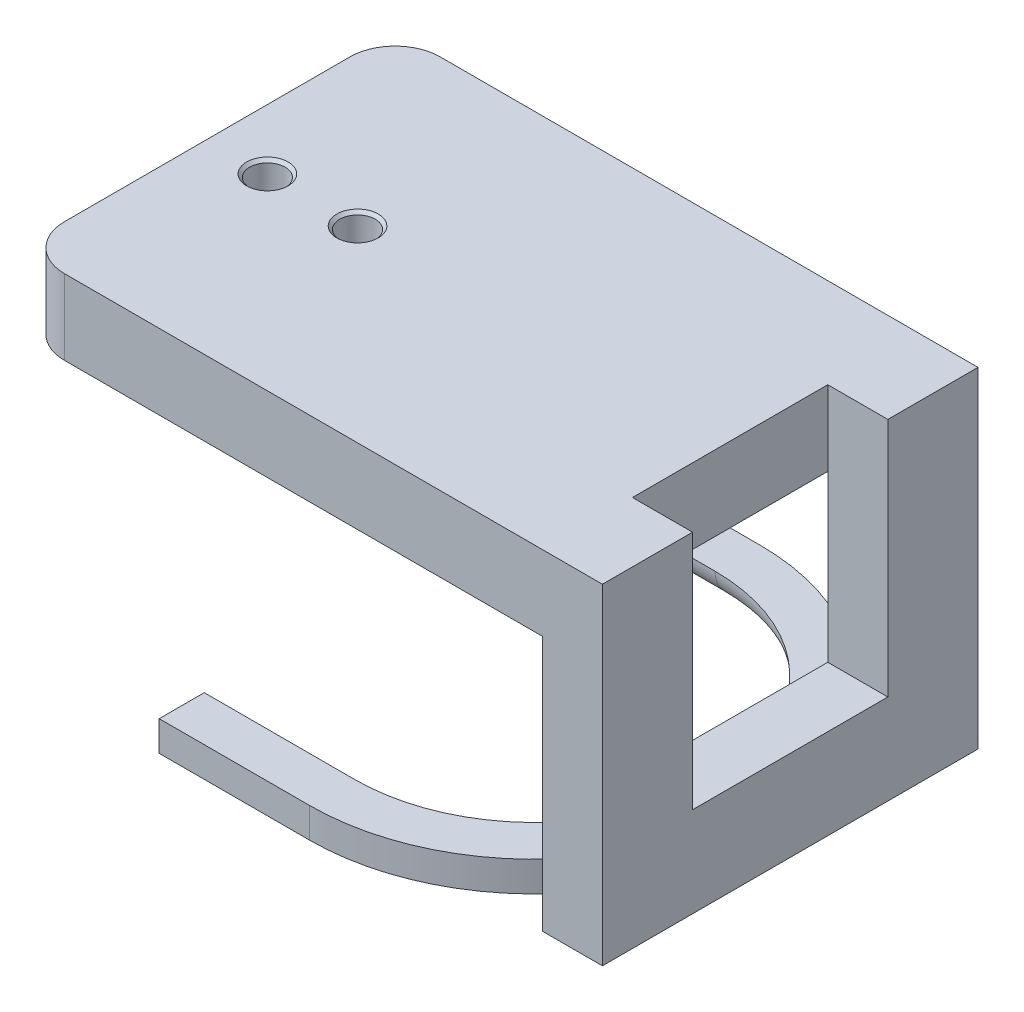
ISO-10303-21;
HEADER;
FILE_DESCRIPTION(('STEP AP214'),'2;1');
FILE_NAME('part.step','',(''),(''),'','','');
FILE_SCHEMA(('AUTOMOTIVE_DESIGN { 1 0 10303 214 1 1 1 1 }'));
ENDSEC;
DATA;
#1=APPLICATION_CONTEXT('core data for automotive mechanical design processes');
#2=APPLICATION_PROTOCOL_DEFINITION('international standard','automotive_design',2000,#1);
#3=PRODUCT_CONTEXT('',#1,'mechanical');
#4=PRODUCT('Part','Part','',(#3));
#5=PRODUCT_RELATED_PRODUCT_CATEGORY('part','',(#4));
#6=PRODUCT_DEFINITION_FORMATION('','',#4);
#7=PRODUCT_DEFINITION_CONTEXT('part definition',#1,'design');
#8=PRODUCT_DEFINITION('design','',#6,#7);
#9=PRODUCT_DEFINITION_SHAPE('','',#8);
#10=(LENGTH_UNIT() NAMED_UNIT(*) SI_UNIT(.MILLI.,.METRE.));
#11=(NAMED_UNIT(*) PLANE_ANGLE_UNIT() SI_UNIT($,.RADIAN.));
#12=(NAMED_UNIT(*) SI_UNIT($,.STERADIAN.) SOLID_ANGLE_UNIT());
#13=UNCERTAINTY_MEASURE_WITH_UNIT(LENGTH_MEASURE(1.E-05),#10,'distance_accuracy_value','');
#14=(GEOMETRIC_REPRESENTATION_CONTEXT(3) GLOBAL_UNCERTAINTY_ASSIGNED_CONTEXT((#13)) GLOBAL_UNIT_ASSIGNED_CONTEXT((#10,
#11,#12)) REPRESENTATION_CONTEXT('',''));
#15=CARTESIAN_POINT('',(0.,0.,0.));
#16=DIRECTION('',(0.,0.,1.));
#17=DIRECTION('',(1.,0.,0.));
#18=AXIS2_PLACEMENT_3D('',#15,#16,#17);
#19=CARTESIAN_POINT('',(14.986,-19.05,-0.635));
#20=DIRECTION('',(1.,0.,0.));
#21=DIRECTION('',(0.,0.,-1.));
#22=AXIS2_PLACEMENT_3D('',#19,#20,#21);
#23=PLANE('',#22);
#24=DIRECTION('',(0.,0.,1.));
#25=VECTOR('',#24,1.);
#26=CARTESIAN_POINT('',(14.986,-19.05,-0.635));
#27=LINE('',#26,#25);
#28=CARTESIAN_POINT('',(14.986,-19.05,-0.635));
#29=VERTEX_POINT('',#28);
#30=CARTESIAN_POINT('',(14.986,-19.05,3.175));
#31=VERTEX_POINT('',#30);
#32=EDGE_CURVE('E140',#29,#31,#27,.T.);
#33=ORIENTED_EDGE('',*,*,#32,.F.);
#34=CARTESIAN_POINT('',(14.986,-19.05,1.905));
#35=DIRECTION('',(1.,0.,0.));
#36=DIRECTION('',(0.,0.,-1.));
#37=AXIS2_PLACEMENT_3D('',#34,#35,#36);
#38=CIRCLE('',#37,2.54);
#39=CARTESIAN_POINT('',(14.986,-21.59,1.905));
#40=VERTEX_POINT('',#39);
#41=EDGE_CURVE('E52',#29,#40,#38,.F.);
#42=ORIENTED_EDGE('',*,*,#41,.T.);
#43=DIRECTION('',(0.,0.,1.));
#44=VECTOR('',#43,1.);
#45=CARTESIAN_POINT('',(14.986,-21.59,-0.635));
#46=LINE('',#45,#44);
#47=CARTESIAN_POINT('',(14.986,-21.59,3.175));
#48=VERTEX_POINT('',#47);
#49=EDGE_CURVE('E130',#40,#48,#46,.T.);
#50=ORIENTED_EDGE('',*,*,#49,.T.);
#51=DIRECTION('',(0.,-1.,0.));
#52=VECTOR('',#51,1.);
#53=CARTESIAN_POINT('',(14.986,-19.05,3.175));
#54=LINE('',#53,#52);
#55=EDGE_CURVE('E153',#31,#48,#54,.T.);
#56=ORIENTED_EDGE('',*,*,#55,.F.);
#57=EDGE_LOOP('',(#33,#42,#50,#56));
#58=FACE_BOUND('',#57,.T.);
#59=ADVANCED_FACE('F43',(#58),#23,.F.);
#60=CARTESIAN_POINT('',(27.686,-19.05,3.17500000000001));
#61=DIRECTION('',(0.,0.,-1.));
#62=DIRECTION('',(-1.,0.,0.));
#63=AXIS2_PLACEMENT_3D('',#60,#61,#62);
#64=PLANE('',#63);
#65=DIRECTION('',(1.,0.,0.));
#66=VECTOR('',#65,1.);
#67=CARTESIAN_POINT('',(27.686,-21.59,3.17500000000001));
#68=LINE('',#67,#66);
#69=CARTESIAN_POINT('',(27.686,-21.59,3.17500000000001));
#70=VERTEX_POINT('',#69);
#71=EDGE_CURVE('E132',#48,#70,#68,.T.);
#72=ORIENTED_EDGE('',*,*,#71,.T.);
#73=DIRECTION('',(0.,-1.,0.));
#74=VECTOR('',#73,1.);
#75=CARTESIAN_POINT('',(27.686,-19.05,3.17500000000001));
#76=LINE('',#75,#74);
#77=CARTESIAN_POINT('',(27.686,-19.05,3.17500000000001));
#78=VERTEX_POINT('',#77);
#79=EDGE_CURVE('E156',#78,#70,#76,.T.);
#80=ORIENTED_EDGE('',*,*,#79,.F.);
#81=DIRECTION('',(1.,0.,0.));
#82=VECTOR('',#81,1.);
#83=CARTESIAN_POINT('',(27.686,-19.05,3.17500000000001));
#84=LINE('',#83,#82);
#85=EDGE_CURVE('E138',#31,#78,#84,.T.);
#86=ORIENTED_EDGE('',*,*,#85,.F.);
#87=ORIENTED_EDGE('',*,*,#55,.T.);
#88=EDGE_LOOP('',(#72,#80,#86,#87));
#89=FACE_BOUND('',#88,.T.);
#90=ADVANCED_FACE('F182',(#89),#64,.F.);
#91=CARTESIAN_POINT('',(27.686,-19.05,-15.875));
#92=DIRECTION('',(0.,-1.,0.));
#93=DIRECTION('',(0.,0.,-1.));
#94=AXIS2_PLACEMENT_3D('',#91,#92,#93);
#95=CYLINDRICAL_SURFACE('',#94,19.05);
#96=CARTESIAN_POINT('',(27.686,-21.59,-15.875));
#97=DIRECTION('',(0.,-1.,0.));
#98=DIRECTION('',(1.,0.,0.));
#99=AXIS2_PLACEMENT_3D('',#96,#97,#98);
#100=CIRCLE('',#99,19.05);
#101=CARTESIAN_POINT('',(27.686,-21.59,-34.925));
#102=VERTEX_POINT('',#101);
#103=EDGE_CURVE('E150',#70,#102,#100,.F.);
#104=ORIENTED_EDGE('',*,*,#103,.T.);
#105=DIRECTION('',(0.,-1.,0.));
#106=VECTOR('',#105,1.);
#107=CARTESIAN_POINT('',(27.686,-19.05,-34.925));
#108=LINE('',#107,#106);
#109=CARTESIAN_POINT('',(27.686,-19.05,-34.925));
#110=VERTEX_POINT('',#109);
#111=EDGE_CURVE('E159',#110,#102,#108,.T.);
#112=ORIENTED_EDGE('',*,*,#111,.F.);
#113=CARTESIAN_POINT('',(27.686,-19.05,-15.875));
#114=DIRECTION('',(0.,-1.,0.));
#115=DIRECTION('',(1.,0.,0.));
#116=AXIS2_PLACEMENT_3D('',#113,#114,#115);
#117=CIRCLE('',#116,19.05);
#118=EDGE_CURVE('E136',#78,#110,#117,.F.);
#119=ORIENTED_EDGE('',*,*,#118,.F.);
#120=ORIENTED_EDGE('',*,*,#79,.T.);
#121=EDGE_LOOP('',(#104,#112,#119,#120));
#122=FACE_BOUND('',#121,.T.);
#123=ADVANCED_FACE('F186',(#122),#95,.T.);
#124=CARTESIAN_POINT('',(27.686,-19.05,-34.925));
#125=DIRECTION('',(0.,0.,1.));
#126=DIRECTION('',(0.,-1.,0.));
#127=AXIS2_PLACEMENT_3D('',#124,#125,#126);
#128=PLANE('',#127);
#129=DIRECTION('',(1.,0.,0.));
#130=VECTOR('',#129,1.);
#131=CARTESIAN_POINT('',(27.686,-21.59,-34.925));
#132=LINE('',#131,#130);
#133=CARTESIAN_POINT('',(14.986,-21.59,-34.925));
#134=VERTEX_POINT('',#133);
#135=EDGE_CURVE('E148',#102,#134,#132,.F.);
#136=ORIENTED_EDGE('',*,*,#135,.T.);
#137=DIRECTION('',(0.,-1.,0.));
#138=VECTOR('',#137,1.);
#139=CARTESIAN_POINT('',(14.986,-19.05,-34.925));
#140=LINE('',#139,#138);
#141=CARTESIAN_POINT('',(14.986,-19.05,-34.925));
#142=VERTEX_POINT('',#141);
#143=EDGE_CURVE('E146',#142,#134,#140,.T.);
#144=ORIENTED_EDGE('',*,*,#143,.F.);
#145=DIRECTION('',(1.,0.,0.));
#146=VECTOR('',#145,1.);
#147=CARTESIAN_POINT('',(27.686,-19.05,-34.925));
#148=LINE('',#147,#146);
#149=EDGE_CURVE('E125',#110,#142,#148,.F.);
#150=ORIENTED_EDGE('',*,*,#149,.F.);
#151=ORIENTED_EDGE('',*,*,#111,.T.);
#152=EDGE_LOOP('',(#136,#144,#150,#151));
#153=FACE_BOUND('',#152,.T.);
#154=ADVANCED_FACE('F189',(#153),#128,.F.);
#155=CARTESIAN_POINT('',(14.986,-19.05,-34.925));
#156=DIRECTION('',(1.,0.,0.));
#157=DIRECTION('',(0.,0.,-1.));
#158=AXIS2_PLACEMENT_3D('',#155,#156,#157);
#159=PLANE('',#158);
#160=DIRECTION('',(0.,0.,1.));
#161=VECTOR('',#160,1.);
#162=CARTESIAN_POINT('',(14.986,-21.59,-34.925));
#163=LINE('',#162,#161);
#164=CARTESIAN_POINT('',(14.986,-21.59,-33.655));
#165=VERTEX_POINT('',#164);
#166=EDGE_CURVE('E117',#134,#165,#163,.T.);
#167=ORIENTED_EDGE('',*,*,#166,.T.);
#168=CARTESIAN_POINT('',(14.986,-19.05,-33.655));
#169=DIRECTION('',(1.,0.,0.));
#170=DIRECTION('',(0.,0.,-1.));
#171=AXIS2_PLACEMENT_3D('',#168,#169,#170);
#172=CIRCLE('',#171,2.54);
#173=CARTESIAN_POINT('',(14.986,-19.05,-31.115));
#174=VERTEX_POINT('',#173);
#175=EDGE_CURVE('E12',#165,#174,#172,.F.);
#176=ORIENTED_EDGE('',*,*,#175,.T.);
#177=DIRECTION('',(0.,0.,1.));
#178=VECTOR('',#177,1.);
#179=CARTESIAN_POINT('',(14.986,-19.05,-34.925));
#180=LINE('',#179,#178);
#181=EDGE_CURVE('E115',#142,#174,#180,.T.);
#182=ORIENTED_EDGE('',*,*,#181,.F.);
#183=ORIENTED_EDGE('',*,*,#143,.T.);
#184=EDGE_LOOP('',(#167,#176,#182,#183));
#185=FACE_BOUND('',#184,.T.);
#186=ADVANCED_FACE('F113',(#185),#159,.F.);
#187=CARTESIAN_POINT('',(27.686,-19.05,-15.875));
#188=DIRECTION('',(0.,-1.,0.));
#189=DIRECTION('',(1.,0.,0.));
#190=AXIS2_PLACEMENT_3D('',#187,#188,#189);
#191=PLANE('',#190);
#192=DIRECTION('',(1.,0.,0.));
#193=VECTOR('',#192,1.);
#194=CARTESIAN_POINT('',(27.686,-19.05,-31.115));
#195=LINE('',#194,#193);
#196=CARTESIAN_POINT('',(27.686,-19.05,-31.115));
#197=VERTEX_POINT('',#196);
#198=EDGE_CURVE('E122',#197,#174,#195,.F.);
#199=ORIENTED_EDGE('',*,*,#198,.F.);
#200=CARTESIAN_POINT('',(27.686,-19.05,-15.875));
#201=DIRECTION('',(0.,-1.,0.));
#202=DIRECTION('',(1.,0.,0.));
#203=AXIS2_PLACEMENT_3D('',#200,#201,#202);
#204=CIRCLE('',#203,15.24);
#205=CARTESIAN_POINT('',(27.686,-19.05,-0.634999999999995));
#206=VERTEX_POINT('',#205);
#207=EDGE_CURVE('E144',#206,#197,#204,.F.);
#208=ORIENTED_EDGE('',*,*,#207,.F.);
#209=DIRECTION('',(1.,0.,0.));
#210=VECTOR('',#209,1.);
#211=CARTESIAN_POINT('',(27.686,-19.05,-0.634999999999995));
#212=LINE('',#211,#210);
#213=EDGE_CURVE('E142',#29,#206,#212,.T.);
#214=ORIENTED_EDGE('',*,*,#213,.F.);
#215=ORIENTED_EDGE('',*,*,#32,.T.);
#216=ORIENTED_EDGE('',*,*,#85,.T.);
#217=ORIENTED_EDGE('',*,*,#118,.T.);
#218=ORIENTED_EDGE('',*,*,#149,.T.);
#219=ORIENTED_EDGE('',*,*,#181,.T.);
#220=EDGE_LOOP('',(#199,#208,#214,#215,#216,#217,#218,#219));
#221=FACE_BOUND('',#220,.T.);
#222=ADVANCED_FACE('F121',(#221),#191,.F.);
#223=CARTESIAN_POINT('',(27.686,-21.59,-15.875));
#224=DIRECTION('',(0.,-1.,0.));
#225=DIRECTION('',(1.,0.,0.));
#226=AXIS2_PLACEMENT_3D('',#223,#224,#225);
#227=PLANE('',#226);
#228=ORIENTED_EDGE('',*,*,#49,.F.);
#229=DIRECTION('',(1.,0.,0.));
#230=VECTOR('',#229,1.);
#231=CARTESIAN_POINT('',(27.686,-21.59,1.905));
#232=LINE('',#231,#230);
#233=CARTESIAN_POINT('',(27.686,-21.59,1.905));
#234=VERTEX_POINT('',#233);
#235=EDGE_CURVE('E166',#40,#234,#232,.T.);
#236=ORIENTED_EDGE('',*,*,#235,.T.);
#237=CARTESIAN_POINT('',(27.686,-21.59,-15.875));
#238=DIRECTION('',(0.,-1.,0.));
#239=DIRECTION('',(0.,0.,-1.));
#240=AXIS2_PLACEMENT_3D('',#237,#238,#239);
#241=CIRCLE('',#240,17.78);
#242=CARTESIAN_POINT('',(27.686,-21.59,-33.655));
#243=VERTEX_POINT('',#242);
#244=EDGE_CURVE('E60',#234,#243,#241,.F.);
#245=ORIENTED_EDGE('',*,*,#244,.T.);
#246=DIRECTION('',(-1.,0.,0.));
#247=VECTOR('',#246,1.);
#248=CARTESIAN_POINT('',(27.686,-21.59,-33.655));
#249=LINE('',#248,#247);
#250=EDGE_CURVE('E164',#243,#165,#249,.T.);
#251=ORIENTED_EDGE('',*,*,#250,.T.);
#252=ORIENTED_EDGE('',*,*,#166,.F.);
#253=ORIENTED_EDGE('',*,*,#135,.F.);
#254=ORIENTED_EDGE('',*,*,#103,.F.);
#255=ORIENTED_EDGE('',*,*,#71,.F.);
#256=EDGE_LOOP('',(#228,#236,#245,#251,#252,#253,#254,#255));
#257=FACE_BOUND('',#256,.T.);
#258=ADVANCED_FACE('F177',(#257),#227,.T.);
#259=CARTESIAN_POINT('',(27.686,-19.05,-33.655));
#260=DIRECTION('',(-1.,0.,0.));
#261=DIRECTION('',(0.,0.,1.));
#262=AXIS2_PLACEMENT_3D('',#259,#260,#261);
#263=CYLINDRICAL_SURFACE('',#262,2.54);
#264=ORIENTED_EDGE('',*,*,#175,.F.);
#265=ORIENTED_EDGE('',*,*,#250,.F.);
#266=CARTESIAN_POINT('',(27.686,-19.05,-33.655));
#267=DIRECTION('',(1.,0.,0.));
#268=DIRECTION('',(0.,0.,-1.));
#269=AXIS2_PLACEMENT_3D('',#266,#267,#268);
#270=CIRCLE('',#269,2.54);
#271=EDGE_CURVE('E47',#197,#243,#270,.T.);
#272=ORIENTED_EDGE('',*,*,#271,.F.);
#273=ORIENTED_EDGE('',*,*,#198,.T.);
#274=EDGE_LOOP('',(#264,#265,#272,#273));
#275=FACE_BOUND('',#274,.T.);
#276=ADVANCED_FACE('F45',(#275),#263,.T.);
#277=CARTESIAN_POINT('',(27.686,-19.05,-15.875));
#278=DIRECTION('',(0.,-1.,0.));
#279=DIRECTION('',(0.,0.,-1.));
#280=AXIS2_PLACEMENT_3D('',#277,#278,#279);
#281=TOROIDAL_SURFACE('',#280,17.78,2.54);
#282=ORIENTED_EDGE('',*,*,#271,.T.);
#283=ORIENTED_EDGE('',*,*,#244,.F.);
#284=CARTESIAN_POINT('',(27.686,-19.05,1.905));
#285=DIRECTION('',(-1.,0.,0.));
#286=DIRECTION('',(0.,0.,1.));
#287=AXIS2_PLACEMENT_3D('',#284,#285,#286);
#288=CIRCLE('',#287,2.54);
#289=EDGE_CURVE('E68',#206,#234,#288,.T.);
#290=ORIENTED_EDGE('',*,*,#289,.F.);
#291=ORIENTED_EDGE('',*,*,#207,.T.);
#292=EDGE_LOOP('',(#282,#283,#290,#291));
#293=FACE_BOUND('',#292,.T.);
#294=ADVANCED_FACE('F169',(#293),#281,.T.);
#295=CARTESIAN_POINT('',(27.686,-19.05,1.905));
#296=DIRECTION('',(1.,0.,0.));
#297=DIRECTION('',(0.,0.,-1.));
#298=AXIS2_PLACEMENT_3D('',#295,#296,#297);
#299=CYLINDRICAL_SURFACE('',#298,2.54);
#300=ORIENTED_EDGE('',*,*,#41,.F.);
#301=ORIENTED_EDGE('',*,*,#213,.T.);
#302=ORIENTED_EDGE('',*,*,#289,.T.);
#303=ORIENTED_EDGE('',*,*,#235,.F.);
#304=EDGE_LOOP('',(#300,#301,#302,#303));
#305=FACE_BOUND('',#304,.T.);
#306=ADVANCED_FACE('F172',(#305),#299,.T.);
#307=CLOSED_SHELL('',(#59,#90,#123,#154,#186,#222,#258,#276,#294,#306));
#308=MANIFOLD_SOLID_BREP('B2',#307);
#309=CARTESIAN_POINT('',(44.196,6.35,0.));
#310=DIRECTION('',(-1.,0.,0.));
#311=DIRECTION('',(0.,0.,1.));
#312=AXIS2_PLACEMENT_3D('',#309,#310,#311);
#313=PLANE('',#312);
#314=DIRECTION('',(0.,1.,0.));
#315=VECTOR('',#314,1.);
#316=CARTESIAN_POINT('',(44.196,6.35,-7.62));
#317=LINE('',#316,#315);
#318=CARTESIAN_POINT('',(44.196,0.,-7.62));
#319=VERTEX_POINT('',#318);
#320=CARTESIAN_POINT('',(44.196,6.35,-7.62));
#321=VERTEX_POINT('',#320);
#322=EDGE_CURVE('E41',#319,#321,#317,.T.);
#323=ORIENTED_EDGE('',*,*,#322,.F.);
#324=DIRECTION('',(0.,0.,-1.));
#325=VECTOR('',#324,1.);
#326=CARTESIAN_POINT('',(44.196,0.,0.));
#327=LINE('',#326,#325);
#328=CARTESIAN_POINT('',(44.196,0.,-24.13));
#329=VERTEX_POINT('',#328);
#330=EDGE_CURVE('E457',#319,#329,#327,.T.);
#331=ORIENTED_EDGE('',*,*,#330,.T.);
#332=DIRECTION('',(0.,-1.,0.));
#333=VECTOR('',#332,1.);
#334=CARTESIAN_POINT('',(44.196,-13.97,-24.13));
#335=LINE('',#334,#333);
#336=CARTESIAN_POINT('',(44.196,6.35,-24.13));
#337=VERTEX_POINT('',#336);
#338=EDGE_CURVE('E289',#337,#329,#335,.T.);
#339=ORIENTED_EDGE('',*,*,#338,.F.);
#340=DIRECTION('',(0.,0.,-1.));
#341=VECTOR('',#340,1.);
#342=CARTESIAN_POINT('',(44.196,6.35,0.));
#343=LINE('',#342,#341);
#344=EDGE_CURVE('E378',#321,#337,#343,.T.);
#345=ORIENTED_EDGE('',*,*,#344,.F.);
#346=EDGE_LOOP('',(#323,#331,#339,#345));
#347=FACE_BOUND('',#346,.T.);
#348=ADVANCED_FACE('F271',(#347),#313,.F.);
#349=CARTESIAN_POINT('',(0.,6.35,0.));
#350=DIRECTION('',(1.,0.,0.));
#351=DIRECTION('',(0.,0.,-1.));
#352=AXIS2_PLACEMENT_3D('',#349,#350,#351);
#353=PLANE('',#352);
#354=DIRECTION('',(0.,0.,1.));
#355=VECTOR('',#354,1.);
#356=CARTESIAN_POINT('',(0.,0.,0.));
#357=LINE('',#356,#355);
#358=CARTESIAN_POINT('',(0.,0.,-27.94));
#359=VERTEX_POINT('',#358);
#360=CARTESIAN_POINT('',(0.,0.,-3.81));
#361=VERTEX_POINT('',#360);
#362=EDGE_CURVE('E446',#359,#361,#357,.T.);
#363=ORIENTED_EDGE('',*,*,#362,.T.);
#364=DIRECTION('',(0.,-1.,0.));
#365=VECTOR('',#364,1.);
#366=CARTESIAN_POINT('',(0.,6.35,-3.81));
#367=LINE('',#366,#365);
#368=CARTESIAN_POINT('',(0.,6.35,-3.81));
#369=VERTEX_POINT('',#368);
#370=EDGE_CURVE('E529',#361,#369,#367,.F.);
#371=ORIENTED_EDGE('',*,*,#370,.T.);
#372=DIRECTION('',(0.,0.,1.));
#373=VECTOR('',#372,1.);
#374=CARTESIAN_POINT('',(0.,6.35,0.));
#375=LINE('',#374,#373);
#376=CARTESIAN_POINT('',(0.,6.35,-27.94));
#377=VERTEX_POINT('',#376);
#378=EDGE_CURVE('E379',#377,#369,#375,.T.);
#379=ORIENTED_EDGE('',*,*,#378,.F.);
#380=DIRECTION('',(0.,-1.,0.));
#381=VECTOR('',#380,1.);
#382=CARTESIAN_POINT('',(0.,6.35,-27.94));
#383=LINE('',#382,#381);
#384=EDGE_CURVE('E535',#377,#359,#383,.T.);
#385=ORIENTED_EDGE('',*,*,#384,.T.);
#386=EDGE_LOOP('',(#363,#371,#379,#385));
#387=FACE_BOUND('',#386,.T.);
#388=ADVANCED_FACE('F493',(#387),#353,.F.);
#389=CARTESIAN_POINT('',(0.,6.35,0.));
#390=DIRECTION('',(0.,0.,-1.));
#391=DIRECTION('',(-1.,0.,0.));
#392=AXIS2_PLACEMENT_3D('',#389,#390,#391);
#393=PLANE('',#392);
#394=DIRECTION('',(1.,0.,0.));
#395=VECTOR('',#394,1.);
#396=CARTESIAN_POINT('',(0.,6.35,0.));
#397=LINE('',#396,#395);
#398=CARTESIAN_POINT('',(3.81,6.35,0.));
#399=VERTEX_POINT('',#398);
#400=CARTESIAN_POINT('',(49.276,6.35,0.));
#401=VERTEX_POINT('',#400);
#402=EDGE_CURVE('E366',#399,#401,#397,.T.);
#403=ORIENTED_EDGE('',*,*,#402,.F.);
#404=DIRECTION('',(0.,-1.,0.));
#405=VECTOR('',#404,1.);
#406=CARTESIAN_POINT('',(3.81,6.35,0.));
#407=LINE('',#406,#405);
#408=CARTESIAN_POINT('',(3.81,0.,0.));
#409=VERTEX_POINT('',#408);
#410=EDGE_CURVE('E530',#399,#409,#407,.T.);
#411=ORIENTED_EDGE('',*,*,#410,.T.);
#412=DIRECTION('',(1.,0.,0.));
#413=VECTOR('',#412,1.);
#414=CARTESIAN_POINT('',(0.,0.,0.));
#415=LINE('',#414,#413);
#416=CARTESIAN_POINT('',(44.196,0.,0.));
#417=VERTEX_POINT('',#416);
#418=EDGE_CURVE('E450',#409,#417,#415,.T.);
#419=ORIENTED_EDGE('',*,*,#418,.T.);
#420=DIRECTION('',(0.,-1.,0.));
#421=VECTOR('',#420,1.);
#422=CARTESIAN_POINT('',(44.196,6.35,0.));
#423=LINE('',#422,#421);
#424=CARTESIAN_POINT('',(44.196,-21.59,0.));
#425=VERTEX_POINT('',#424);
#426=EDGE_CURVE('E417',#417,#425,#423,.T.);
#427=ORIENTED_EDGE('',*,*,#426,.T.);
#428=DIRECTION('',(-1.,0.,0.));
#429=VECTOR('',#428,1.);
#430=CARTESIAN_POINT('',(49.276,-21.59,0.));
#431=LINE('',#430,#429);
#432=CARTESIAN_POINT('',(49.276,-21.59,0.));
#433=VERTEX_POINT('',#432);
#434=EDGE_CURVE('E385',#433,#425,#431,.T.);
#435=ORIENTED_EDGE('',*,*,#434,.F.);
#436=DIRECTION('',(0.,-1.,0.));
#437=VECTOR('',#436,1.);
#438=CARTESIAN_POINT('',(49.276,6.35,0.));
#439=LINE('',#438,#437);
#440=EDGE_CURVE('E382',#401,#433,#439,.T.);
#441=ORIENTED_EDGE('',*,*,#440,.F.);
#442=EDGE_LOOP('',(#403,#411,#419,#427,#435,#441));
#443=FACE_BOUND('',#442,.T.);
#444=ADVANCED_FACE('F383',(#443),#393,.F.);
#445=CARTESIAN_POINT('',(0.,6.35,-31.75));
#446=DIRECTION('',(0.,0.,1.));
#447=DIRECTION('',(1.,0.,0.));
#448=AXIS2_PLACEMENT_3D('',#445,#446,#447);
#449=PLANE('',#448);
#450=DIRECTION('',(-1.,0.,0.));
#451=VECTOR('',#450,1.);
#452=CARTESIAN_POINT('',(0.,0.,-31.75));
#453=LINE('',#452,#451);
#454=CARTESIAN_POINT('',(44.196,0.,-31.75));
#455=VERTEX_POINT('',#454);
#456=CARTESIAN_POINT('',(3.81,0.,-31.75));
#457=VERTEX_POINT('',#456);
#458=EDGE_CURVE('E422',#455,#457,#453,.T.);
#459=ORIENTED_EDGE('',*,*,#458,.T.);
#460=DIRECTION('',(0.,-1.,0.));
#461=VECTOR('',#460,1.);
#462=CARTESIAN_POINT('',(3.81,6.35,-31.75));
#463=LINE('',#462,#461);
#464=CARTESIAN_POINT('',(3.81,6.35,-31.75));
#465=VERTEX_POINT('',#464);
#466=EDGE_CURVE('E281',#457,#465,#463,.F.);
#467=ORIENTED_EDGE('',*,*,#466,.T.);
#468=DIRECTION('',(-1.,0.,0.));
#469=VECTOR('',#468,1.);
#470=CARTESIAN_POINT('',(0.,6.35,-31.75));
#471=LINE('',#470,#469);
#472=CARTESIAN_POINT('',(49.276,6.35,-31.75));
#473=VERTEX_POINT('',#472);
#474=EDGE_CURVE('E426',#473,#465,#471,.T.);
#475=ORIENTED_EDGE('',*,*,#474,.F.);
#476=DIRECTION('',(0.,1.,0.));
#477=VECTOR('',#476,1.);
#478=CARTESIAN_POINT('',(49.276,6.35,-31.75));
#479=LINE('',#478,#477);
#480=CARTESIAN_POINT('',(49.276,-21.59,-31.75));
#481=VERTEX_POINT('',#480);
#482=EDGE_CURVE('E401',#481,#473,#479,.T.);
#483=ORIENTED_EDGE('',*,*,#482,.F.);
#484=DIRECTION('',(-1.,0.,0.));
#485=VECTOR('',#484,1.);
#486=CARTESIAN_POINT('',(49.276,-21.59,-31.75));
#487=LINE('',#486,#485);
#488=CARTESIAN_POINT('',(44.196,-21.59,-31.75));
#489=VERTEX_POINT('',#488);
#490=EDGE_CURVE('E444',#481,#489,#487,.T.);
#491=ORIENTED_EDGE('',*,*,#490,.T.);
#492=DIRECTION('',(0.,1.,0.));
#493=VECTOR('',#492,1.);
#494=CARTESIAN_POINT('',(44.196,6.35,-31.75));
#495=LINE('',#494,#493);
#496=EDGE_CURVE('E420',#489,#455,#495,.T.);
#497=ORIENTED_EDGE('',*,*,#496,.T.);
#498=EDGE_LOOP('',(#459,#467,#475,#483,#491,#497));
#499=FACE_BOUND('',#498,.T.);
#500=ADVANCED_FACE('F501',(#499),#449,.F.);
#501=CARTESIAN_POINT('',(0.,6.35,0.));
#502=DIRECTION('',(0.,-1.,0.));
#503=DIRECTION('',(0.,0.,-1.));
#504=AXIS2_PLACEMENT_3D('',#501,#502,#503);
#505=PLANE('',#504);
#506=CARTESIAN_POINT('',(12.7,6.35,-15.875));
#507=DIRECTION('',(0.,-1.,0.));
#508=DIRECTION('',(0.,0.,-1.));
#509=AXIS2_PLACEMENT_3D('',#506,#507,#508);
#510=CIRCLE('',#509,1.75399999999999);
#511=CARTESIAN_POINT('',(12.7,6.35,-17.629));
#512=VERTEX_POINT('',#511);
#513=EDGE_CURVE('E542',#512,#512,#510,.T.);
#514=ORIENTED_EDGE('',*,*,#513,.T.);
#515=EDGE_LOOP('',(#514));
#516=FACE_BOUND('',#515,.T.);
#517=CARTESIAN_POINT('',(5.08,6.35,-15.875));
#518=DIRECTION('',(0.,-1.,0.));
#519=DIRECTION('',(0.,0.,-1.));
#520=AXIS2_PLACEMENT_3D('',#517,#518,#519);
#521=CIRCLE('',#520,1.754);
#522=CARTESIAN_POINT('',(5.08,6.35,-17.629));
#523=VERTEX_POINT('',#522);
#524=EDGE_CURVE('E545',#523,#523,#521,.T.);
#525=ORIENTED_EDGE('',*,*,#524,.T.);
#526=EDGE_LOOP('',(#525));
#527=FACE_BOUND('',#526,.T.);
#528=ORIENTED_EDGE('',*,*,#378,.T.);
#529=CARTESIAN_POINT('',(3.81,6.35,-3.81));
#530=DIRECTION('',(0.,-1.,0.));
#531=DIRECTION('',(0.,0.,-1.));
#532=AXIS2_PLACEMENT_3D('',#529,#530,#531);
#533=CIRCLE('',#532,3.81);
#534=EDGE_CURVE('E374',#369,#399,#533,.F.);
#535=ORIENTED_EDGE('',*,*,#534,.T.);
#536=ORIENTED_EDGE('',*,*,#402,.T.);
#537=DIRECTION('',(0.,0.,1.));
#538=VECTOR('',#537,1.);
#539=CARTESIAN_POINT('',(49.276,6.35,0.));
#540=LINE('',#539,#538);
#541=CARTESIAN_POINT('',(49.276,6.35,-7.62));
#542=VERTEX_POINT('',#541);
#543=EDGE_CURVE('E372',#542,#401,#540,.T.);
#544=ORIENTED_EDGE('',*,*,#543,.F.);
#545=DIRECTION('',(-1.,0.,0.));
#546=VECTOR('',#545,1.);
#547=CARTESIAN_POINT('',(49.276,6.35,-7.62));
#548=LINE('',#547,#546);
#549=EDGE_CURVE('E411',#542,#321,#548,.T.);
#550=ORIENTED_EDGE('',*,*,#549,.T.);
#551=ORIENTED_EDGE('',*,*,#344,.T.);
#552=DIRECTION('',(-1.,0.,0.));
#553=VECTOR('',#552,1.);
#554=CARTESIAN_POINT('',(49.276,6.35,-24.13));
#555=LINE('',#554,#553);
#556=CARTESIAN_POINT('',(49.276,6.35,-24.13));
#557=VERTEX_POINT('',#556);
#558=EDGE_CURVE('E443',#557,#337,#555,.T.);
#559=ORIENTED_EDGE('',*,*,#558,.F.);
#560=DIRECTION('',(0.,0.,1.));
#561=VECTOR('',#560,1.);
#562=CARTESIAN_POINT('',(49.276,6.35,-24.13));
#563=LINE('',#562,#561);
#564=EDGE_CURVE('E404',#473,#557,#563,.T.);
#565=ORIENTED_EDGE('',*,*,#564,.F.);
#566=ORIENTED_EDGE('',*,*,#474,.T.);
#567=CARTESIAN_POINT('',(3.81,6.35,-27.94));
#568=DIRECTION('',(0.,-1.,0.));
#569=DIRECTION('',(0.,0.,-1.));
#570=AXIS2_PLACEMENT_3D('',#567,#568,#569);
#571=CIRCLE('',#570,3.81);
#572=EDGE_CURVE('E531',#465,#377,#571,.F.);
#573=ORIENTED_EDGE('',*,*,#572,.T.);
#574=EDGE_LOOP('',(#528,#535,#536,#544,#550,#551,#559,#565,#566,#573));
#575=FACE_BOUND('',#574,.T.);
#576=ADVANCED_FACE('F369',(#516,#527,#575),#505,.F.);
#577=CARTESIAN_POINT('',(0.,0.,0.));
#578=DIRECTION('',(0.,-1.,0.));
#579=DIRECTION('',(0.,0.,-1.));
#580=AXIS2_PLACEMENT_3D('',#577,#578,#579);
#581=PLANE('',#580);
#582=CARTESIAN_POINT('',(5.08,0.,-15.875));
#583=DIRECTION('',(0.,-1.,0.));
#584=DIRECTION('',(0.,0.,-1.));
#585=AXIS2_PLACEMENT_3D('',#582,#583,#584);
#586=CIRCLE('',#585,1.754);
#587=CARTESIAN_POINT('',(5.08,0.,-17.629));
#588=VERTEX_POINT('',#587);
#589=EDGE_CURVE('E559',#588,#588,#586,.F.);
#590=ORIENTED_EDGE('',*,*,#589,.T.);
#591=EDGE_LOOP('',(#590));
#592=FACE_BOUND('',#591,.T.);
#593=CARTESIAN_POINT('',(12.7,0.,-15.875));
#594=DIRECTION('',(0.,-1.,0.));
#595=DIRECTION('',(0.,0.,-1.));
#596=AXIS2_PLACEMENT_3D('',#593,#594,#595);
#597=CIRCLE('',#596,1.754);
#598=CARTESIAN_POINT('',(12.7,0.,-17.629));
#599=VERTEX_POINT('',#598);
#600=EDGE_CURVE('E460',#599,#599,#597,.F.);
#601=ORIENTED_EDGE('',*,*,#600,.T.);
#602=EDGE_LOOP('',(#601));
#603=FACE_BOUND('',#602,.T.);
#604=ORIENTED_EDGE('',*,*,#418,.F.);
#605=CARTESIAN_POINT('',(3.81,0.,-3.81));
#606=DIRECTION('',(0.,-1.,0.));
#607=DIRECTION('',(0.,0.,-1.));
#608=AXIS2_PLACEMENT_3D('',#605,#606,#607);
#609=CIRCLE('',#608,3.81);
#610=EDGE_CURVE('E537',#409,#361,#609,.T.);
#611=ORIENTED_EDGE('',*,*,#610,.T.);
#612=ORIENTED_EDGE('',*,*,#362,.F.);
#613=CARTESIAN_POINT('',(3.81,0.,-27.94));
#614=DIRECTION('',(0.,-1.,0.));
#615=DIRECTION('',(0.,0.,-1.));
#616=AXIS2_PLACEMENT_3D('',#613,#614,#615);
#617=CIRCLE('',#616,3.81);
#618=EDGE_CURVE('E539',#359,#457,#617,.T.);
#619=ORIENTED_EDGE('',*,*,#618,.T.);
#620=ORIENTED_EDGE('',*,*,#458,.F.);
#621=EDGE_CURVE('E455',#329,#455,#327,.T.);
#622=ORIENTED_EDGE('',*,*,#621,.F.);
#623=ORIENTED_EDGE('',*,*,#330,.F.);
#624=EDGE_CURVE('E275',#417,#319,#327,.T.);
#625=ORIENTED_EDGE('',*,*,#624,.F.);
#626=EDGE_LOOP('',(#604,#611,#612,#619,#620,#622,#623,#625));
#627=FACE_BOUND('',#626,.T.);
#628=ADVANCED_FACE('F490',(#592,#603,#627),#581,.T.);
#629=CARTESIAN_POINT('',(12.7,6.35,-15.875));
#630=DIRECTION('',(0.,1.,0.));
#631=DIRECTION('',(0.,0.,1.));
#632=AXIS2_PLACEMENT_3D('',#629,#630,#631);
#633=CYLINDRICAL_SURFACE('',#632,1.49999999999999);
#634=CARTESIAN_POINT('',(12.7,0.254000000000004,-15.875));
#635=DIRECTION('',(0.,-1.,0.));
#636=DIRECTION('',(0.,0.,-1.));
#637=AXIS2_PLACEMENT_3D('',#634,#635,#636);
#638=CIRCLE('',#637,1.49999999999999);
#639=CARTESIAN_POINT('',(12.7,0.254000000000004,-17.375));
#640=VERTEX_POINT('',#639);
#641=EDGE_CURVE('E548',#640,#640,#638,.T.);
#642=ORIENTED_EDGE('',*,*,#641,.T.);
#643=EDGE_LOOP('',(#642));
#644=FACE_BOUND('',#643,.T.);
#645=CARTESIAN_POINT('',(12.7,6.096,-15.875));
#646=DIRECTION('',(0.,-1.,0.));
#647=DIRECTION('',(0.,0.,-1.));
#648=AXIS2_PLACEMENT_3D('',#645,#646,#647);
#649=CIRCLE('',#648,1.49999999999999);
#650=CARTESIAN_POINT('',(12.7,6.096,-17.375));
#651=VERTEX_POINT('',#650);
#652=EDGE_CURVE('E551',#651,#651,#649,.F.);
#653=ORIENTED_EDGE('',*,*,#652,.T.);
#654=EDGE_LOOP('',(#653));
#655=FACE_BOUND('',#654,.T.);
#656=ADVANCED_FACE('F599',(#644,#655),#633,.F.);
#657=CARTESIAN_POINT('',(5.08,6.35,-15.875));
#658=DIRECTION('',(0.,1.,0.));
#659=DIRECTION('',(0.,0.,1.));
#660=AXIS2_PLACEMENT_3D('',#657,#658,#659);
#661=CYLINDRICAL_SURFACE('',#660,1.49999999999999);
#662=CARTESIAN_POINT('',(5.08,0.254000000000004,-15.875));
#663=DIRECTION('',(0.,-1.,0.));
#664=DIRECTION('',(0.,0.,-1.));
#665=AXIS2_PLACEMENT_3D('',#662,#663,#664);
#666=CIRCLE('',#665,1.49999999999999);
#667=CARTESIAN_POINT('',(5.08,0.254000000000004,-17.375));
#668=VERTEX_POINT('',#667);
#669=EDGE_CURVE('E554',#668,#668,#666,.T.);
#670=ORIENTED_EDGE('',*,*,#669,.T.);
#671=EDGE_LOOP('',(#670));
#672=FACE_BOUND('',#671,.T.);
#673=CARTESIAN_POINT('',(5.08,6.096,-15.875));
#674=DIRECTION('',(0.,-1.,0.));
#675=DIRECTION('',(0.,0.,-1.));
#676=AXIS2_PLACEMENT_3D('',#673,#674,#675);
#677=CIRCLE('',#676,1.49999999999999);
#678=CARTESIAN_POINT('',(5.08,6.096,-17.375));
#679=VERTEX_POINT('',#678);
#680=EDGE_CURVE('E557',#679,#679,#677,.F.);
#681=ORIENTED_EDGE('',*,*,#680,.T.);
#682=EDGE_LOOP('',(#681));
#683=FACE_BOUND('',#682,.T.);
#684=ADVANCED_FACE('F509',(#672,#683),#661,.F.);
#685=CARTESIAN_POINT('',(5.08,0.,-15.875));
#686=DIRECTION('',(0.,-1.,0.));
#687=DIRECTION('',(0.,0.,-1.));
#688=AXIS2_PLACEMENT_3D('',#685,#686,#687);
#689=CONICAL_SURFACE('',#688,1.754,0.785398163397444);
#690=ORIENTED_EDGE('',*,*,#669,.F.);
#691=EDGE_LOOP('',(#690));
#692=FACE_BOUND('',#691,.T.);
#693=ORIENTED_EDGE('',*,*,#589,.F.);
#694=EDGE_LOOP('',(#693));
#695=FACE_BOUND('',#694,.T.);
#696=ADVANCED_FACE('F505',(#692,#695),#689,.F.);
#697=CARTESIAN_POINT('',(12.7,0.,-15.875));
#698=DIRECTION('',(0.,-1.,0.));
#699=DIRECTION('',(0.,0.,-1.));
#700=AXIS2_PLACEMENT_3D('',#697,#698,#699);
#701=CONICAL_SURFACE('',#700,1.754,0.785398163397445);
#702=ORIENTED_EDGE('',*,*,#641,.F.);
#703=EDGE_LOOP('',(#702));
#704=FACE_BOUND('',#703,.T.);
#705=ORIENTED_EDGE('',*,*,#600,.F.);
#706=EDGE_LOOP('',(#705));
#707=FACE_BOUND('',#706,.T.);
#708=ADVANCED_FACE('F508',(#704,#707),#701,.F.);
#709=CARTESIAN_POINT('',(12.7,6.096,-15.875));
#710=DIRECTION('',(0.,1.,0.));
#711=DIRECTION('',(0.,0.,1.));
#712=AXIS2_PLACEMENT_3D('',#709,#710,#711);
#713=CONICAL_SURFACE('',#712,1.49999999999999,0.785398163397452);
#714=ORIENTED_EDGE('',*,*,#513,.F.);
#715=EDGE_LOOP('',(#714));
#716=FACE_BOUND('',#715,.T.);
#717=ORIENTED_EDGE('',*,*,#652,.F.);
#718=EDGE_LOOP('',(#717));
#719=FACE_BOUND('',#718,.T.);
#720=ADVANCED_FACE('F513',(#716,#719),#713,.F.);
#721=CARTESIAN_POINT('',(5.08,6.096,-15.875));
#722=DIRECTION('',(0.,1.,0.));
#723=DIRECTION('',(0.,0.,1.));
#724=AXIS2_PLACEMENT_3D('',#721,#722,#723);
#725=CONICAL_SURFACE('',#724,1.49999999999999,0.785398163397451);
#726=ORIENTED_EDGE('',*,*,#524,.F.);
#727=EDGE_LOOP('',(#726));
#728=FACE_BOUND('',#727,.T.);
#729=ORIENTED_EDGE('',*,*,#680,.F.);
#730=EDGE_LOOP('',(#729));
#731=FACE_BOUND('',#730,.T.);
#732=ADVANCED_FACE('F517',(#728,#731),#725,.F.);
#733=CARTESIAN_POINT('',(3.81,6.35,-3.81));
#734=DIRECTION('',(0.,-1.,0.));
#735=DIRECTION('',(0.,0.,-1.));
#736=AXIS2_PLACEMENT_3D('',#733,#734,#735);
#737=CYLINDRICAL_SURFACE('',#736,3.81);
#738=ORIENTED_EDGE('',*,*,#534,.F.);
#739=ORIENTED_EDGE('',*,*,#370,.F.);
#740=ORIENTED_EDGE('',*,*,#610,.F.);
#741=ORIENTED_EDGE('',*,*,#410,.F.);
#742=EDGE_LOOP('',(#738,#739,#740,#741));
#743=FACE_BOUND('',#742,.T.);
#744=ADVANCED_FACE('F520',(#743),#737,.T.);
#745=CARTESIAN_POINT('',(3.81,6.35,-27.94));
#746=DIRECTION('',(0.,-1.,0.));
#747=DIRECTION('',(0.,0.,-1.));
#748=AXIS2_PLACEMENT_3D('',#745,#746,#747);
#749=CYLINDRICAL_SURFACE('',#748,3.81);
#750=ORIENTED_EDGE('',*,*,#572,.F.);
#751=ORIENTED_EDGE('',*,*,#466,.F.);
#752=ORIENTED_EDGE('',*,*,#618,.F.);
#753=ORIENTED_EDGE('',*,*,#384,.F.);
#754=EDGE_LOOP('',(#750,#751,#752,#753));
#755=FACE_BOUND('',#754,.T.);
#756=ADVANCED_FACE('F273',(#755),#749,.T.);
#757=CARTESIAN_POINT('',(49.276,-21.59,-31.75));
#758=DIRECTION('',(0.,1.,0.));
#759=DIRECTION('',(0.,0.,1.));
#760=AXIS2_PLACEMENT_3D('',#757,#758,#759);
#761=PLANE('',#760);
#762=DIRECTION('',(0.,0.,-1.));
#763=VECTOR('',#762,1.);
#764=CARTESIAN_POINT('',(44.196,-21.59,-31.75));
#765=LINE('',#764,#763);
#766=EDGE_CURVE('E414',#425,#489,#765,.T.);
#767=ORIENTED_EDGE('',*,*,#766,.T.);
#768=ORIENTED_EDGE('',*,*,#490,.F.);
#769=DIRECTION('',(0.,0.,-1.));
#770=VECTOR('',#769,1.);
#771=CARTESIAN_POINT('',(49.276,-21.59,-31.75));
#772=LINE('',#771,#770);
#773=EDGE_CURVE('E388',#433,#481,#772,.T.);
#774=ORIENTED_EDGE('',*,*,#773,.F.);
#775=ORIENTED_EDGE('',*,*,#434,.T.);
#776=EDGE_LOOP('',(#767,#768,#774,#775));
#777=FACE_BOUND('',#776,.T.);
#778=ADVANCED_FACE('F527',(#777),#761,.F.);
#779=CARTESIAN_POINT('',(49.276,-13.97,-24.13));
#780=DIRECTION('',(0.,0.,-1.));
#781=DIRECTION('',(-1.,0.,0.));
#782=AXIS2_PLACEMENT_3D('',#779,#780,#781);
#783=PLANE('',#782);
#784=ORIENTED_EDGE('',*,*,#338,.T.);
#785=CARTESIAN_POINT('',(44.196,-13.97,-24.13));
#786=VERTEX_POINT('',#785);
#787=EDGE_CURVE('E577',#329,#786,#335,.T.);
#788=ORIENTED_EDGE('',*,*,#787,.T.);
#789=DIRECTION('',(-1.,0.,0.));
#790=VECTOR('',#789,1.);
#791=CARTESIAN_POINT('',(49.276,-13.97,-24.13));
#792=LINE('',#791,#790);
#793=CARTESIAN_POINT('',(49.276,-13.97,-24.13));
#794=VERTEX_POINT('',#793);
#795=EDGE_CURVE('E440',#794,#786,#792,.T.);
#796=ORIENTED_EDGE('',*,*,#795,.F.);
#797=DIRECTION('',(0.,-1.,0.));
#798=VECTOR('',#797,1.);
#799=CARTESIAN_POINT('',(49.276,-13.97,-24.13));
#800=LINE('',#799,#798);
#801=EDGE_CURVE('E406',#557,#794,#800,.T.);
#802=ORIENTED_EDGE('',*,*,#801,.F.);
#803=ORIENTED_EDGE('',*,*,#558,.T.);
#804=EDGE_LOOP('',(#784,#788,#796,#802,#803));
#805=FACE_BOUND('',#804,.T.);
#806=ADVANCED_FACE('F581',(#805),#783,.F.);
#807=CARTESIAN_POINT('',(49.276,-13.97,-7.62));
#808=DIRECTION('',(0.,-1.,0.));
#809=DIRECTION('',(0.,0.,-1.));
#810=AXIS2_PLACEMENT_3D('',#807,#808,#809);
#811=PLANE('',#810);
#812=DIRECTION('',(0.,0.,1.));
#813=VECTOR('',#812,1.);
#814=CARTESIAN_POINT('',(44.196,-13.97,-7.62));
#815=LINE('',#814,#813);
#816=CARTESIAN_POINT('',(44.196,-13.97,-7.62));
#817=VERTEX_POINT('',#816);
#818=EDGE_CURVE('E397',#786,#817,#815,.T.);
#819=ORIENTED_EDGE('',*,*,#818,.T.);
#820=DIRECTION('',(-1.,0.,0.));
#821=VECTOR('',#820,1.);
#822=CARTESIAN_POINT('',(49.276,-13.97,-7.62));
#823=LINE('',#822,#821);
#824=CARTESIAN_POINT('',(49.276,-13.97,-7.62));
#825=VERTEX_POINT('',#824);
#826=EDGE_CURVE('E437',#825,#817,#823,.T.);
#827=ORIENTED_EDGE('',*,*,#826,.F.);
#828=DIRECTION('',(0.,0.,1.));
#829=VECTOR('',#828,1.);
#830=CARTESIAN_POINT('',(49.276,-13.97,-7.62));
#831=LINE('',#830,#829);
#832=EDGE_CURVE('E408',#794,#825,#831,.T.);
#833=ORIENTED_EDGE('',*,*,#832,.F.);
#834=ORIENTED_EDGE('',*,*,#795,.T.);
#835=EDGE_LOOP('',(#819,#827,#833,#834));
#836=FACE_BOUND('',#835,.T.);
#837=ADVANCED_FACE('F584',(#836),#811,.F.);
#838=CARTESIAN_POINT('',(49.276,6.35,-7.62));
#839=DIRECTION('',(0.,0.,1.));
#840=DIRECTION('',(0.,-1.,0.));
#841=AXIS2_PLACEMENT_3D('',#838,#839,#840);
#842=PLANE('',#841);
#843=EDGE_CURVE('E394',#817,#319,#317,.T.);
#844=ORIENTED_EDGE('',*,*,#843,.T.);
#845=ORIENTED_EDGE('',*,*,#322,.T.);
#846=ORIENTED_EDGE('',*,*,#549,.F.);
#847=DIRECTION('',(0.,1.,0.));
#848=VECTOR('',#847,1.);
#849=CARTESIAN_POINT('',(49.276,6.35,-7.62));
#850=LINE('',#849,#848);
#851=EDGE_CURVE('E392',#825,#542,#850,.T.);
#852=ORIENTED_EDGE('',*,*,#851,.F.);
#853=ORIENTED_EDGE('',*,*,#826,.T.);
#854=EDGE_LOOP('',(#844,#845,#846,#852,#853));
#855=FACE_BOUND('',#854,.T.);
#856=ADVANCED_FACE('F478',(#855),#842,.F.);
#857=CARTESIAN_POINT('',(49.276,0.,0.));
#858=DIRECTION('',(-1.,0.,0.));
#859=DIRECTION('',(0.,0.,1.));
#860=AXIS2_PLACEMENT_3D('',#857,#858,#859);
#861=PLANE('',#860);
#862=ORIENTED_EDGE('',*,*,#543,.T.);
#863=ORIENTED_EDGE('',*,*,#440,.T.);
#864=ORIENTED_EDGE('',*,*,#773,.T.);
#865=ORIENTED_EDGE('',*,*,#482,.T.);
#866=ORIENTED_EDGE('',*,*,#564,.T.);
#867=ORIENTED_EDGE('',*,*,#801,.T.);
#868=ORIENTED_EDGE('',*,*,#832,.T.);
#869=ORIENTED_EDGE('',*,*,#851,.T.);
#870=EDGE_LOOP('',(#862,#863,#864,#865,#866,#867,#868,#869));
#871=FACE_BOUND('',#870,.T.);
#872=ADVANCED_FACE('F390',(#871),#861,.F.);
#873=CARTESIAN_POINT('',(44.196,0.,0.));
#874=DIRECTION('',(-1.,0.,0.));
#875=DIRECTION('',(0.,0.,1.));
#876=AXIS2_PLACEMENT_3D('',#873,#874,#875);
#877=PLANE('',#876);
#878=ORIENTED_EDGE('',*,*,#426,.F.);
#879=ORIENTED_EDGE('',*,*,#624,.T.);
#880=ORIENTED_EDGE('',*,*,#843,.F.);
#881=ORIENTED_EDGE('',*,*,#818,.F.);
#882=ORIENTED_EDGE('',*,*,#787,.F.);
#883=ORIENTED_EDGE('',*,*,#621,.T.);
#884=ORIENTED_EDGE('',*,*,#496,.F.);
#885=ORIENTED_EDGE('',*,*,#766,.F.);
#886=EDGE_LOOP('',(#878,#879,#880,#881,#882,#883,#884,#885));
#887=FACE_BOUND('',#886,.T.);
#888=ADVANCED_FACE('F485',(#887),#877,.T.);
#889=CLOSED_SHELL('',(#348,#388,#444,#500,#576,#628,#656,#684,#696,#708,#720,#732,#744,#756,
#778,#806,#837,#856,#872,#888));
#890=MANIFOLD_SOLID_BREP('B6',#889);
#891=ADVANCED_BREP_SHAPE_REPRESENTATION('',(#18,#308,#890),#14);
#892=SHAPE_DEFINITION_REPRESENTATION(#9,#891);
ENDSEC;
END-ISO-10303-21;
